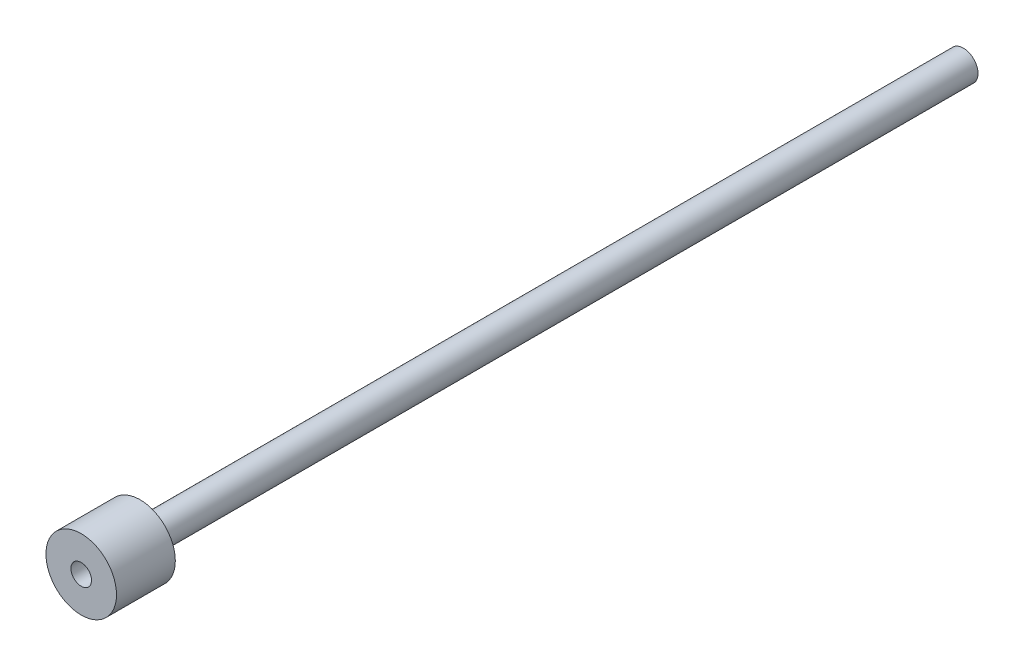
ISO-10303-21;
HEADER;
FILE_DESCRIPTION(('STEP AP214'),'2;1');
FILE_NAME('part.step','',(''),(''),'','','');
FILE_SCHEMA(('AUTOMOTIVE_DESIGN { 1 0 10303 214 1 1 1 1 }'));
ENDSEC;
DATA;
#1=APPLICATION_CONTEXT('core data for automotive mechanical design processes');
#2=APPLICATION_PROTOCOL_DEFINITION('international standard','automotive_design',2000,#1);
#3=PRODUCT_CONTEXT('',#1,'mechanical');
#4=PRODUCT('Part','Part','',(#3));
#5=PRODUCT_RELATED_PRODUCT_CATEGORY('part','',(#4));
#6=PRODUCT_DEFINITION_FORMATION('','',#4);
#7=PRODUCT_DEFINITION_CONTEXT('part definition',#1,'design');
#8=PRODUCT_DEFINITION('design','',#6,#7);
#9=PRODUCT_DEFINITION_SHAPE('','',#8);
#10=(LENGTH_UNIT() NAMED_UNIT(*) SI_UNIT(.MILLI.,.METRE.));
#11=(NAMED_UNIT(*) PLANE_ANGLE_UNIT() SI_UNIT($,.RADIAN.));
#12=(NAMED_UNIT(*) SI_UNIT($,.STERADIAN.) SOLID_ANGLE_UNIT());
#13=UNCERTAINTY_MEASURE_WITH_UNIT(LENGTH_MEASURE(1.E-05),#10,'distance_accuracy_value','');
#14=(GEOMETRIC_REPRESENTATION_CONTEXT(3) GLOBAL_UNCERTAINTY_ASSIGNED_CONTEXT((#13)) GLOBAL_UNIT_ASSIGNED_CONTEXT((#10,
#11,#12)) REPRESENTATION_CONTEXT('',''));
#15=CARTESIAN_POINT('',(0.,0.,0.));
#16=DIRECTION('',(0.,0.,1.));
#17=DIRECTION('',(1.,0.,0.));
#18=AXIS2_PLACEMENT_3D('',#15,#16,#17);
#19=CARTESIAN_POINT('',(0.,0.,20.));
#20=DIRECTION('',(0.,0.,-1.));
#21=DIRECTION('',(-1.,0.,0.));
#22=AXIS2_PLACEMENT_3D('',#19,#20,#21);
#23=CYLINDRICAL_SURFACE('',#22,12.);
#24=CARTESIAN_POINT('',(0.,0.,20.));
#25=DIRECTION('',(0.,0.,1.));
#26=DIRECTION('',(1.,0.,0.));
#27=AXIS2_PLACEMENT_3D('',#24,#25,#26);
#28=CIRCLE('',#27,12.);
#29=CARTESIAN_POINT('',(12.,0.,20.));
#30=VERTEX_POINT('',#29);
#31=EDGE_CURVE('E10',#30,#30,#28,.T.);
#32=ORIENTED_EDGE('',*,*,#31,.F.);
#33=EDGE_LOOP('',(#32));
#34=FACE_BOUND('',#33,.T.);
#35=CARTESIAN_POINT('',(0.,0.,0.));
#36=DIRECTION('',(0.,0.,1.));
#37=DIRECTION('',(1.,0.,0.));
#38=AXIS2_PLACEMENT_3D('',#35,#36,#37);
#39=CIRCLE('',#38,12.);
#40=CARTESIAN_POINT('',(12.,0.,0.));
#41=VERTEX_POINT('',#40);
#42=EDGE_CURVE('E36',#41,#41,#39,.T.);
#43=ORIENTED_EDGE('',*,*,#42,.T.);
#44=EDGE_LOOP('',(#43));
#45=FACE_BOUND('',#44,.T.);
#46=ADVANCED_FACE('F33',(#34,#45),#23,.T.);
#47=CARTESIAN_POINT('',(0.,0.,20.));
#48=DIRECTION('',(0.,0.,1.));
#49=DIRECTION('',(1.,0.,0.));
#50=AXIS2_PLACEMENT_3D('',#47,#48,#49);
#51=PLANE('',#50);
#52=CARTESIAN_POINT('',(0.,0.,20.));
#53=DIRECTION('',(0.,0.,1.));
#54=DIRECTION('',(1.,0.,0.));
#55=AXIS2_PLACEMENT_3D('',#52,#53,#54);
#56=CIRCLE('',#55,3.5);
#57=CARTESIAN_POINT('',(3.5,0.,20.));
#58=VERTEX_POINT('',#57);
#59=EDGE_CURVE('E53',#58,#58,#56,.T.);
#60=ORIENTED_EDGE('',*,*,#59,.F.);
#61=EDGE_LOOP('',(#60));
#62=FACE_BOUND('',#61,.T.);
#63=ORIENTED_EDGE('',*,*,#31,.T.);
#64=EDGE_LOOP('',(#63));
#65=FACE_BOUND('',#64,.T.);
#66=ADVANCED_FACE('F76',(#62,#65),#51,.T.);
#67=CARTESIAN_POINT('',(0.,0.,0.));
#68=DIRECTION('',(0.,0.,1.));
#69=DIRECTION('',(1.,0.,0.));
#70=AXIS2_PLACEMENT_3D('',#67,#68,#69);
#71=PLANE('',#70);
#72=CARTESIAN_POINT('',(0.,0.,0.));
#73=DIRECTION('',(0.,0.,-1.));
#74=DIRECTION('',(-1.,0.,0.));
#75=AXIS2_PLACEMENT_3D('',#72,#73,#74);
#76=CIRCLE('',#75,8.75);
#77=CARTESIAN_POINT('',(-8.75,0.,0.));
#78=VERTEX_POINT('',#77);
#79=EDGE_CURVE('E45',#78,#78,#76,.T.);
#80=ORIENTED_EDGE('',*,*,#79,.F.);
#81=EDGE_LOOP('',(#80));
#82=FACE_BOUND('',#81,.T.);
#83=ORIENTED_EDGE('',*,*,#42,.F.);
#84=EDGE_LOOP('',(#83));
#85=FACE_BOUND('',#84,.T.);
#86=ADVANCED_FACE('F81',(#82,#85),#71,.F.);
#87=CARTESIAN_POINT('',(0.,0.,15.));
#88=DIRECTION('',(0.,0.,-1.));
#89=DIRECTION('',(-1.,0.,0.));
#90=AXIS2_PLACEMENT_3D('',#87,#88,#89);
#91=CYLINDRICAL_SURFACE('',#90,8.75);
#92=CARTESIAN_POINT('',(0.,0.,15.));
#93=DIRECTION('',(0.,0.,-1.));
#94=DIRECTION('',(-1.,0.,0.));
#95=AXIS2_PLACEMENT_3D('',#92,#93,#94);
#96=CIRCLE('',#95,8.75);
#97=CARTESIAN_POINT('',(-8.75,0.,15.));
#98=VERTEX_POINT('',#97);
#99=EDGE_CURVE('E43',#98,#98,#96,.T.);
#100=ORIENTED_EDGE('',*,*,#99,.F.);
#101=EDGE_LOOP('',(#100));
#102=FACE_BOUND('',#101,.T.);
#103=ORIENTED_EDGE('',*,*,#79,.T.);
#104=EDGE_LOOP('',(#103));
#105=FACE_BOUND('',#104,.T.);
#106=ADVANCED_FACE('F88',(#102,#105),#91,.F.);
#107=CARTESIAN_POINT('',(0.,0.,15.));
#108=DIRECTION('',(0.,0.,-1.));
#109=DIRECTION('',(-1.,0.,0.));
#110=AXIS2_PLACEMENT_3D('',#107,#108,#109);
#111=PLANE('',#110);
#112=CARTESIAN_POINT('',(0.,0.,15.));
#113=DIRECTION('',(0.,0.,-1.));
#114=DIRECTION('',(-1.,0.,0.));
#115=AXIS2_PLACEMENT_3D('',#112,#113,#114);
#116=CIRCLE('',#115,5.);
#117=CARTESIAN_POINT('',(-5.,0.,15.));
#118=VERTEX_POINT('',#117);
#119=EDGE_CURVE('E48',#118,#118,#116,.T.);
#120=ORIENTED_EDGE('',*,*,#119,.F.);
#121=EDGE_LOOP('',(#120));
#122=FACE_BOUND('',#121,.T.);
#123=ORIENTED_EDGE('',*,*,#99,.T.);
#124=EDGE_LOOP('',(#123));
#125=FACE_BOUND('',#124,.T.);
#126=ADVANCED_FACE('F93',(#122,#125),#111,.T.);
#127=CARTESIAN_POINT('',(0.,0.,15.));
#128=DIRECTION('',(0.,0.,-1.));
#129=DIRECTION('',(-1.,0.,0.));
#130=AXIS2_PLACEMENT_3D('',#127,#128,#129);
#131=CYLINDRICAL_SURFACE('',#130,5.);
#132=ORIENTED_EDGE('',*,*,#119,.T.);
#133=EDGE_LOOP('',(#132));
#134=FACE_BOUND('',#133,.T.);
#135=CARTESIAN_POINT('',(0.,0.,-280.));
#136=DIRECTION('',(0.,0.,-1.));
#137=DIRECTION('',(-1.,0.,0.));
#138=AXIS2_PLACEMENT_3D('',#135,#136,#137);
#139=CIRCLE('',#138,5.);
#140=CARTESIAN_POINT('',(-5.,0.,-280.));
#141=VERTEX_POINT('',#140);
#142=EDGE_CURVE('E56',#141,#141,#139,.T.);
#143=ORIENTED_EDGE('',*,*,#142,.F.);
#144=EDGE_LOOP('',(#143));
#145=FACE_BOUND('',#144,.T.);
#146=ADVANCED_FACE('F72',(#134,#145),#131,.T.);
#147=CARTESIAN_POINT('',(0.,0.,0.));
#148=DIRECTION('',(0.,0.,1.));
#149=DIRECTION('',(1.,0.,0.));
#150=AXIS2_PLACEMENT_3D('',#147,#148,#149);
#151=CYLINDRICAL_SURFACE('',#150,3.5);
#152=ORIENTED_EDGE('',*,*,#59,.T.);
#153=EDGE_LOOP('',(#152));
#154=FACE_BOUND('',#153,.T.);
#155=CARTESIAN_POINT('',(0.,0.,-280.));
#156=DIRECTION('',(0.,0.,-1.));
#157=DIRECTION('',(-1.,0.,0.));
#158=AXIS2_PLACEMENT_3D('',#155,#156,#157);
#159=CIRCLE('',#158,3.5);
#160=CARTESIAN_POINT('',(-3.5,0.,-280.));
#161=VERTEX_POINT('',#160);
#162=EDGE_CURVE('E59',#161,#161,#159,.T.);
#163=ORIENTED_EDGE('',*,*,#162,.T.);
#164=EDGE_LOOP('',(#163));
#165=FACE_BOUND('',#164,.T.);
#166=ADVANCED_FACE('F63',(#154,#165),#151,.F.);
#167=CARTESIAN_POINT('',(0.,0.,-280.));
#168=DIRECTION('',(0.,0.,-1.));
#169=DIRECTION('',(-1.,0.,0.));
#170=AXIS2_PLACEMENT_3D('',#167,#168,#169);
#171=PLANE('',#170);
#172=ORIENTED_EDGE('',*,*,#142,.T.);
#173=EDGE_LOOP('',(#172));
#174=FACE_BOUND('',#173,.T.);
#175=ORIENTED_EDGE('',*,*,#162,.F.);
#176=EDGE_LOOP('',(#175));
#177=FACE_BOUND('',#176,.T.);
#178=ADVANCED_FACE('F65',(#174,#177),#171,.T.);
#179=CLOSED_SHELL('',(#46,#66,#86,#106,#126,#146,#166,#178));
#180=MANIFOLD_SOLID_BREP('B2',#179);
#181=ADVANCED_BREP_SHAPE_REPRESENTATION('',(#18,#180),#14);
#182=SHAPE_DEFINITION_REPRESENTATION(#9,#181);
ENDSEC;
END-ISO-10303-21;
